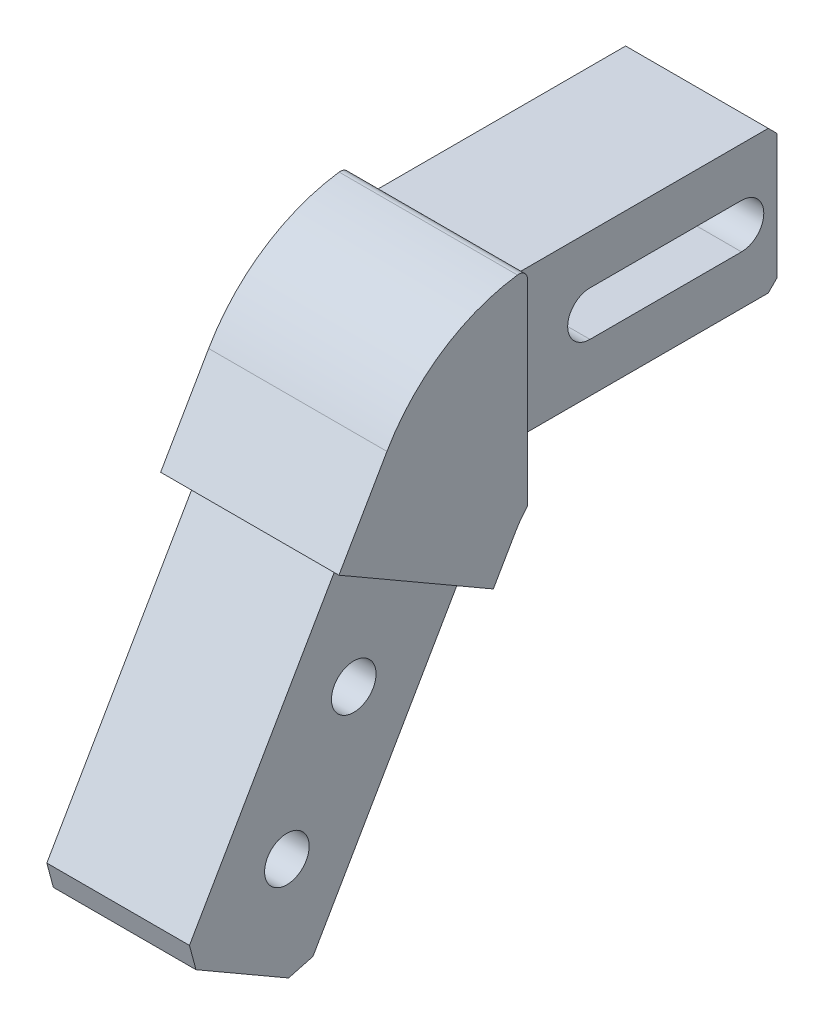
ISO-10303-21;
HEADER;
FILE_DESCRIPTION(('STEP AP214'),'2;1');
FILE_NAME('part.step','',(''),(''),'','','');
FILE_SCHEMA(('AUTOMOTIVE_DESIGN { 1 0 10303 214 1 1 1 1 }'));
ENDSEC;
DATA;
#1=APPLICATION_CONTEXT('core data for automotive mechanical design processes');
#2=APPLICATION_PROTOCOL_DEFINITION('international standard','automotive_design',2000,#1);
#3=PRODUCT_CONTEXT('',#1,'mechanical');
#4=PRODUCT('Part','Part','',(#3));
#5=PRODUCT_RELATED_PRODUCT_CATEGORY('part','',(#4));
#6=PRODUCT_DEFINITION_FORMATION('','',#4);
#7=PRODUCT_DEFINITION_CONTEXT('part definition',#1,'design');
#8=PRODUCT_DEFINITION('design','',#6,#7);
#9=PRODUCT_DEFINITION_SHAPE('','',#8);
#10=(LENGTH_UNIT() NAMED_UNIT(*) SI_UNIT(.MILLI.,.METRE.));
#11=(NAMED_UNIT(*) PLANE_ANGLE_UNIT() SI_UNIT($,.RADIAN.));
#12=(NAMED_UNIT(*) SI_UNIT($,.STERADIAN.) SOLID_ANGLE_UNIT());
#13=UNCERTAINTY_MEASURE_WITH_UNIT(LENGTH_MEASURE(1.E-05),#10,'distance_accuracy_value','');
#14=(GEOMETRIC_REPRESENTATION_CONTEXT(3) GLOBAL_UNCERTAINTY_ASSIGNED_CONTEXT((#13)) GLOBAL_UNIT_ASSIGNED_CONTEXT((#10,
#11,#12)) REPRESENTATION_CONTEXT('',''));
#15=CARTESIAN_POINT('',(0.,0.,0.));
#16=DIRECTION('',(0.,0.,1.));
#17=DIRECTION('',(1.,0.,0.));
#18=AXIS2_PLACEMENT_3D('',#15,#16,#17);
#19=CARTESIAN_POINT('',(16.,-10.,-17.3205080756888));
#20=DIRECTION('',(-1.,0.,0.));
#21=DIRECTION('',(0.,0.,1.));
#22=AXIS2_PLACEMENT_3D('',#19,#20,#21);
#23=PLANE('',#22);
#24=CARTESIAN_POINT('',(16.,10.,-19.0000000000001));
#25=DIRECTION('',(1.,0.,0.));
#26=DIRECTION('',(0.,0.,-1.));
#27=AXIS2_PLACEMENT_3D('',#24,#25,#26);
#28=CIRCLE('',#27,2.5);
#29=CARTESIAN_POINT('',(16.,12.5,-19.0000000000001));
#30=VERTEX_POINT('',#29);
#31=CARTESIAN_POINT('',(16.,7.5,-19.0000000000001));
#32=VERTEX_POINT('',#31);
#33=EDGE_CURVE('E254',#30,#32,#28,.T.);
#34=ORIENTED_EDGE('',*,*,#33,.F.);
#35=DIRECTION('',(0.,0.,1.));
#36=VECTOR('',#35,1.);
#37=CARTESIAN_POINT('',(16.,12.5,-19.0000000000001));
#38=LINE('',#37,#36);
#39=CARTESIAN_POINT('',(16.,12.5,-36.0000000000001));
#40=VERTEX_POINT('',#39);
#41=EDGE_CURVE('E262',#40,#30,#38,.T.);
#42=ORIENTED_EDGE('',*,*,#41,.F.);
#43=CARTESIAN_POINT('',(16.,10.,-36.0000000000001));
#44=DIRECTION('',(1.,0.,0.));
#45=DIRECTION('',(0.,0.,-1.));
#46=AXIS2_PLACEMENT_3D('',#43,#44,#45);
#47=CIRCLE('',#46,2.5);
#48=CARTESIAN_POINT('',(16.,7.5,-36.0000000000001));
#49=VERTEX_POINT('',#48);
#50=EDGE_CURVE('E259',#49,#40,#47,.T.);
#51=ORIENTED_EDGE('',*,*,#50,.F.);
#52=DIRECTION('',(0.,0.,-1.));
#53=VECTOR('',#52,1.);
#54=CARTESIAN_POINT('',(16.,7.5,-36.0000000000001));
#55=LINE('',#54,#53);
#56=EDGE_CURVE('E256',#32,#49,#55,.T.);
#57=ORIENTED_EDGE('',*,*,#56,.F.);
#58=EDGE_LOOP('',(#34,#42,#51,#57));
#59=FACE_BOUND('',#58,.T.);
#60=DIRECTION('',(0.,0.,1.));
#61=VECTOR('',#60,1.);
#62=CARTESIAN_POINT('',(16.,18.,-15.0000000000001));
#63=LINE('',#62,#61);
#64=CARTESIAN_POINT('',(16.,18.,-39.0000000000001));
#65=VERTEX_POINT('',#64);
#66=CARTESIAN_POINT('',(16.,18.,-10.));
#67=VERTEX_POINT('',#66);
#68=EDGE_CURVE('E300',#65,#67,#63,.T.);
#69=ORIENTED_EDGE('',*,*,#68,.T.);
#70=DIRECTION('',(0.,-1.,0.));
#71=VECTOR('',#70,1.);
#72=CARTESIAN_POINT('',(16.,-10.,-10.));
#73=LINE('',#72,#71);
#74=CARTESIAN_POINT('',(16.,2.,-10.));
#75=VERTEX_POINT('',#74);
#76=EDGE_CURVE('E246',#67,#75,#73,.T.);
#77=ORIENTED_EDGE('',*,*,#76,.T.);
#78=DIRECTION('',(0.,0.,-1.));
#79=VECTOR('',#78,1.);
#80=CARTESIAN_POINT('',(16.,2.,-15.0000000000001));
#81=LINE('',#80,#79);
#82=CARTESIAN_POINT('',(16.,2.,-39.0000000000001));
#83=VERTEX_POINT('',#82);
#84=EDGE_CURVE('E311',#75,#83,#81,.T.);
#85=ORIENTED_EDGE('',*,*,#84,.T.);
#86=DIRECTION('',(0.,0.707106781186547,-0.707106781186548));
#87=VECTOR('',#86,1.);
#88=CARTESIAN_POINT('',(16.,2.,-39.0000000000001));
#89=LINE('',#88,#87);
#90=CARTESIAN_POINT('',(16.,3.,-40.0000000000001));
#91=VERTEX_POINT('',#90);
#92=EDGE_CURVE('E313',#83,#91,#89,.T.);
#93=ORIENTED_EDGE('',*,*,#92,.T.);
#94=DIRECTION('',(0.,1.,0.));
#95=VECTOR('',#94,1.);
#96=CARTESIAN_POINT('',(16.,3.,-40.0000000000001));
#97=LINE('',#96,#95);
#98=CARTESIAN_POINT('',(16.,17.,-40.0000000000001));
#99=VERTEX_POINT('',#98);
#100=EDGE_CURVE('E315',#91,#99,#97,.T.);
#101=ORIENTED_EDGE('',*,*,#100,.T.);
#102=DIRECTION('',(0.,0.707106781186547,0.707106781186547));
#103=VECTOR('',#102,1.);
#104=CARTESIAN_POINT('',(16.,18.,-39.0000000000001));
#105=LINE('',#104,#103);
#106=EDGE_CURVE('E297',#99,#65,#105,.T.);
#107=ORIENTED_EDGE('',*,*,#106,.T.);
#108=EDGE_LOOP('',(#69,#77,#85,#93,#101,#107));
#109=FACE_BOUND('',#108,.T.);
#110=ADVANCED_FACE('F39',(#59,#109),#23,.F.);
#111=CARTESIAN_POINT('',(0.,-10.,-17.3205080756888));
#112=DIRECTION('',(-1.,0.,0.));
#113=DIRECTION('',(0.,0.,1.));
#114=AXIS2_PLACEMENT_3D('',#111,#112,#113);
#115=PLANE('',#114);
#116=DIRECTION('',(0.,-1.,0.));
#117=VECTOR('',#116,1.);
#118=CARTESIAN_POINT('',(0.,-10.,-10.));
#119=LINE('',#118,#117);
#120=CARTESIAN_POINT('',(0.,18.,-10.));
#121=VERTEX_POINT('',#120);
#122=CARTESIAN_POINT('',(0.,2.,-10.));
#123=VERTEX_POINT('',#122);
#124=EDGE_CURVE('E244',#121,#123,#119,.T.);
#125=ORIENTED_EDGE('',*,*,#124,.F.);
#126=DIRECTION('',(0.,0.,1.));
#127=VECTOR('',#126,1.);
#128=CARTESIAN_POINT('',(0.,18.,-15.0000000000001));
#129=LINE('',#128,#127);
#130=CARTESIAN_POINT('',(0.,18.,-39.0000000000001));
#131=VERTEX_POINT('',#130);
#132=EDGE_CURVE('E320',#131,#121,#129,.T.);
#133=ORIENTED_EDGE('',*,*,#132,.F.);
#134=DIRECTION('',(0.,0.707106781186547,0.707106781186547));
#135=VECTOR('',#134,1.);
#136=CARTESIAN_POINT('',(0.,18.,-39.0000000000001));
#137=LINE('',#136,#135);
#138=CARTESIAN_POINT('',(0.,17.,-40.0000000000001));
#139=VERTEX_POINT('',#138);
#140=EDGE_CURVE('E294',#139,#131,#137,.T.);
#141=ORIENTED_EDGE('',*,*,#140,.F.);
#142=DIRECTION('',(0.,1.,0.));
#143=VECTOR('',#142,1.);
#144=CARTESIAN_POINT('',(0.,3.,-40.0000000000001));
#145=LINE('',#144,#143);
#146=CARTESIAN_POINT('',(0.,3.,-40.0000000000001));
#147=VERTEX_POINT('',#146);
#148=EDGE_CURVE('E301',#147,#139,#145,.T.);
#149=ORIENTED_EDGE('',*,*,#148,.F.);
#150=DIRECTION('',(0.,0.707106781186547,-0.707106781186548));
#151=VECTOR('',#150,1.);
#152=CARTESIAN_POINT('',(0.,2.,-39.0000000000001));
#153=LINE('',#152,#151);
#154=CARTESIAN_POINT('',(0.,2.,-39.0000000000001));
#155=VERTEX_POINT('',#154);
#156=EDGE_CURVE('E333',#155,#147,#153,.T.);
#157=ORIENTED_EDGE('',*,*,#156,.F.);
#158=DIRECTION('',(0.,0.,-1.));
#159=VECTOR('',#158,1.);
#160=CARTESIAN_POINT('',(0.,2.,-15.0000000000001));
#161=LINE('',#160,#159);
#162=EDGE_CURVE('E331',#123,#155,#161,.T.);
#163=ORIENTED_EDGE('',*,*,#162,.F.);
#164=EDGE_LOOP('',(#125,#133,#141,#149,#157,#163));
#165=FACE_BOUND('',#164,.T.);
#166=DIRECTION('',(0.,0.,1.));
#167=VECTOR('',#166,1.);
#168=CARTESIAN_POINT('',(0.,12.5,-19.0000000000001));
#169=LINE('',#168,#167);
#170=CARTESIAN_POINT('',(0.,12.5,-36.0000000000001));
#171=VERTEX_POINT('',#170);
#172=CARTESIAN_POINT('',(0.,12.5,-19.0000000000001));
#173=VERTEX_POINT('',#172);
#174=EDGE_CURVE('E257',#171,#173,#169,.T.);
#175=ORIENTED_EDGE('',*,*,#174,.T.);
#176=CARTESIAN_POINT('',(0.,10.,-19.0000000000001));
#177=DIRECTION('',(1.,0.,0.));
#178=DIRECTION('',(0.,0.,-1.));
#179=AXIS2_PLACEMENT_3D('',#176,#177,#178);
#180=CIRCLE('',#179,2.5);
#181=CARTESIAN_POINT('',(0.,7.5,-19.0000000000001));
#182=VERTEX_POINT('',#181);
#183=EDGE_CURVE('E253',#173,#182,#180,.T.);
#184=ORIENTED_EDGE('',*,*,#183,.T.);
#185=DIRECTION('',(0.,0.,-1.));
#186=VECTOR('',#185,1.);
#187=CARTESIAN_POINT('',(0.,7.5,-36.0000000000001));
#188=LINE('',#187,#186);
#189=CARTESIAN_POINT('',(0.,7.5,-36.0000000000001));
#190=VERTEX_POINT('',#189);
#191=EDGE_CURVE('E267',#182,#190,#188,.T.);
#192=ORIENTED_EDGE('',*,*,#191,.T.);
#193=CARTESIAN_POINT('',(0.,10.,-36.0000000000001));
#194=DIRECTION('',(1.,0.,0.));
#195=DIRECTION('',(0.,0.,-1.));
#196=AXIS2_PLACEMENT_3D('',#193,#194,#195);
#197=CIRCLE('',#196,2.5);
#198=EDGE_CURVE('E270',#190,#171,#197,.T.);
#199=ORIENTED_EDGE('',*,*,#198,.T.);
#200=EDGE_LOOP('',(#175,#184,#192,#199));
#201=FACE_BOUND('',#200,.T.);
#202=ADVANCED_FACE('F408',(#165,#201),#115,.T.);
#203=CARTESIAN_POINT('',(16.,-12.9903810567665,7.50000000000006));
#204=DIRECTION('',(1.,0.,0.));
#205=DIRECTION('',(0.,0.,-1.));
#206=AXIS2_PLACEMENT_3D('',#203,#204,#205);
#207=CIRCLE('',#206,2.5);
#208=CARTESIAN_POINT('',(16.,-12.9903810567665,5.00000000000006));
#209=VERTEX_POINT('',#208);
#210=EDGE_CURVE('E285',#209,#209,#207,.T.);
#211=ORIENTED_EDGE('',*,*,#210,.F.);
#212=EDGE_LOOP('',(#211));
#213=FACE_BOUND('',#212,.T.);
#214=CARTESIAN_POINT('',(16.,-25.9807621135331,15.0000000000001));
#215=DIRECTION('',(1.,0.,0.));
#216=DIRECTION('',(0.,0.,-1.));
#217=AXIS2_PLACEMENT_3D('',#214,#215,#216);
#218=CIRCLE('',#217,2.5);
#219=CARTESIAN_POINT('',(16.,-25.9807621135331,12.5000000000001));
#220=VERTEX_POINT('',#219);
#221=EDGE_CURVE('E291',#220,#220,#218,.T.);
#222=ORIENTED_EDGE('',*,*,#221,.F.);
#223=EDGE_LOOP('',(#222));
#224=FACE_BOUND('',#223,.T.);
#225=DIRECTION('',(0.,-0.500000000000005,-0.866025403784436));
#226=VECTOR('',#225,1.);
#227=CARTESIAN_POINT('',(16.,-30.6410161513774,26.9282032302756));
#228=LINE('',#227,#226);
#229=CARTESIAN_POINT('',(16.,-31.6410161513774,25.1961524227068));
#230=VERTEX_POINT('',#229);
#231=CARTESIAN_POINT('',(16.,-37.6410161513775,14.8038475772936));
#232=VERTEX_POINT('',#231);
#233=EDGE_CURVE('E306',#230,#232,#228,.T.);
#234=ORIENTED_EDGE('',*,*,#233,.T.);
#235=DIRECTION('',(0.,-0.258819045102513,0.965925826289071));
#236=VECTOR('',#235,1.);
#237=CARTESIAN_POINT('',(16.,-36.9089653438087,12.0717967697247));
#238=LINE('',#237,#236);
#239=CARTESIAN_POINT('',(16.,-36.9089653438087,12.0717967697247));
#240=VERTEX_POINT('',#239);
#241=EDGE_CURVE('E378',#232,#240,#238,.F.);
#242=ORIENTED_EDGE('',*,*,#241,.T.);
#243=DIRECTION('',(0.,0.866025403784436,-0.500000000000004));
#244=VECTOR('',#243,1.);
#245=CARTESIAN_POINT('',(16.,-38.6410161513775,13.0717967697247));
#246=LINE('',#245,#244);
#247=CARTESIAN_POINT('',(16.,-8.33012701892221,-4.42820323027547));
#248=VERTEX_POINT('',#247);
#249=EDGE_CURVE('E309',#240,#248,#246,.T.);
#250=ORIENTED_EDGE('',*,*,#249,.T.);
#251=DIRECTION('',(0.,0.500000000000004,0.866025403784437));
#252=VECTOR('',#251,1.);
#253=CARTESIAN_POINT('',(16.,-14.3301270189223,-14.8205080756887));
#254=LINE('',#253,#252);
#255=CARTESIAN_POINT('',(16.,-0.330127018922152,9.42820323027552));
#256=VERTEX_POINT('',#255);
#257=EDGE_CURVE('E250',#248,#256,#254,.T.);
#258=ORIENTED_EDGE('',*,*,#257,.T.);
#259=DIRECTION('',(0.,-0.866025403784436,0.500000000000004));
#260=VECTOR('',#259,1.);
#261=CARTESIAN_POINT('',(16.,-30.6410161513774,26.9282032302756));
#262=LINE('',#261,#260);
#263=CARTESIAN_POINT('',(16.,-28.9089653438085,25.9282032302756));
#264=VERTEX_POINT('',#263);
#265=EDGE_CURVE('E303',#256,#264,#262,.T.);
#266=ORIENTED_EDGE('',*,*,#265,.T.);
#267=DIRECTION('',(0.,0.96592582628907,0.258819045102513));
#268=VECTOR('',#267,1.);
#269=CARTESIAN_POINT('',(16.,-31.6410161513774,25.1961524227068));
#270=LINE('',#269,#268);
#271=EDGE_CURVE('E376',#264,#230,#270,.F.);
#272=ORIENTED_EDGE('',*,*,#271,.T.);
#273=EDGE_LOOP('',(#234,#242,#250,#258,#266,#272));
#274=FACE_BOUND('',#273,.T.);
#275=ADVANCED_FACE('F411',(#213,#224,#274),#23,.F.);
#276=DIRECTION('',(0.,0.866025403784436,-0.500000000000004));
#277=VECTOR('',#276,1.);
#278=CARTESIAN_POINT('',(0.,-38.6410161513775,13.0717967697247));
#279=LINE('',#278,#277);
#280=CARTESIAN_POINT('',(0.,-36.9089653438087,12.0717967697247));
#281=VERTEX_POINT('',#280);
#282=CARTESIAN_POINT('',(0.,-8.33012701892222,-4.42820323027546));
#283=VERTEX_POINT('',#282);
#284=EDGE_CURVE('E329',#281,#283,#279,.T.);
#285=ORIENTED_EDGE('',*,*,#284,.F.);
#286=DIRECTION('',(0.,0.258819045102513,-0.965925826289071));
#287=VECTOR('',#286,1.);
#288=CARTESIAN_POINT('',(0.,-27.758330249198,-22.0788383248864));
#289=LINE('',#288,#287);
#290=CARTESIAN_POINT('',(0.,-37.6410161513775,14.8038475772936));
#291=VERTEX_POINT('',#290);
#292=EDGE_CURVE('E369',#281,#291,#289,.F.);
#293=ORIENTED_EDGE('',*,*,#292,.T.);
#294=DIRECTION('',(0.,-0.500000000000005,-0.866025403784436));
#295=VECTOR('',#294,1.);
#296=CARTESIAN_POINT('',(0.,-30.6410161513774,26.9282032302756));
#297=LINE('',#296,#295);
#298=CARTESIAN_POINT('',(0.,-31.6410161513774,25.1961524227068));
#299=VERTEX_POINT('',#298);
#300=EDGE_CURVE('E326',#299,#291,#297,.T.);
#301=ORIENTED_EDGE('',*,*,#300,.F.);
#302=DIRECTION('',(0.,-0.96592582628907,-0.258819045102513));
#303=VECTOR('',#302,1.);
#304=CARTESIAN_POINT('',(0.,-22.0788383248861,27.7583302491978));
#305=LINE('',#304,#303);
#306=CARTESIAN_POINT('',(0.,-28.9089653438085,25.9282032302756));
#307=VERTEX_POINT('',#306);
#308=EDGE_CURVE('E367',#299,#307,#305,.F.);
#309=ORIENTED_EDGE('',*,*,#308,.T.);
#310=DIRECTION('',(0.,-0.866025403784436,0.500000000000004));
#311=VECTOR('',#310,1.);
#312=CARTESIAN_POINT('',(0.,-30.6410161513774,26.9282032302756));
#313=LINE('',#312,#311);
#314=CARTESIAN_POINT('',(0.,-0.330127018922146,9.42820323027551));
#315=VERTEX_POINT('',#314);
#316=EDGE_CURVE('E323',#315,#307,#313,.T.);
#317=ORIENTED_EDGE('',*,*,#316,.F.);
#318=DIRECTION('',(0.,0.500000000000004,0.866025403784437));
#319=VECTOR('',#318,1.);
#320=CARTESIAN_POINT('',(0.,-14.3301270189223,-14.8205080756887));
#321=LINE('',#320,#319);
#322=EDGE_CURVE('E248',#283,#315,#321,.T.);
#323=ORIENTED_EDGE('',*,*,#322,.F.);
#324=EDGE_LOOP('',(#285,#293,#301,#309,#317,#323));
#325=FACE_BOUND('',#324,.T.);
#326=CARTESIAN_POINT('',(0.,-25.9807621135331,15.0000000000001));
#327=DIRECTION('',(1.,0.,0.));
#328=DIRECTION('',(0.,0.,-1.));
#329=AXIS2_PLACEMENT_3D('',#326,#327,#328);
#330=CIRCLE('',#329,2.5);
#331=CARTESIAN_POINT('',(0.,-25.9807621135331,12.5000000000001));
#332=VERTEX_POINT('',#331);
#333=EDGE_CURVE('E288',#332,#332,#330,.T.);
#334=ORIENTED_EDGE('',*,*,#333,.T.);
#335=EDGE_LOOP('',(#334));
#336=FACE_BOUND('',#335,.T.);
#337=CARTESIAN_POINT('',(0.,-12.9903810567665,7.50000000000006));
#338=DIRECTION('',(1.,0.,0.));
#339=DIRECTION('',(0.,0.,-1.));
#340=AXIS2_PLACEMENT_3D('',#337,#338,#339);
#341=CIRCLE('',#340,2.5);
#342=CARTESIAN_POINT('',(0.,-12.9903810567665,5.00000000000006));
#343=VERTEX_POINT('',#342);
#344=EDGE_CURVE('E284',#343,#343,#341,.T.);
#345=ORIENTED_EDGE('',*,*,#344,.T.);
#346=EDGE_LOOP('',(#345));
#347=FACE_BOUND('',#346,.T.);
#348=ADVANCED_FACE('F417',(#325,#336,#347),#115,.T.);
#349=CARTESIAN_POINT('',(16.,18.,-39.0000000000001));
#350=DIRECTION('',(0.,-0.707106781186547,0.707106781186547));
#351=DIRECTION('',(0.,-0.707106781186548,-0.707106781186548));
#352=AXIS2_PLACEMENT_3D('',#349,#350,#351);
#353=PLANE('',#352);
#354=ORIENTED_EDGE('',*,*,#140,.T.);
#355=DIRECTION('',(-1.,0.,0.));
#356=VECTOR('',#355,1.);
#357=CARTESIAN_POINT('',(16.,18.,-39.0000000000001));
#358=LINE('',#357,#356);
#359=EDGE_CURVE('E361',#65,#131,#358,.T.);
#360=ORIENTED_EDGE('',*,*,#359,.F.);
#361=ORIENTED_EDGE('',*,*,#106,.F.);
#362=DIRECTION('',(-1.,0.,0.));
#363=VECTOR('',#362,1.);
#364=CARTESIAN_POINT('',(16.,17.,-40.0000000000001));
#365=LINE('',#364,#363);
#366=EDGE_CURVE('E317',#99,#139,#365,.T.);
#367=ORIENTED_EDGE('',*,*,#366,.T.);
#368=EDGE_LOOP('',(#354,#360,#361,#367));
#369=FACE_BOUND('',#368,.T.);
#370=ADVANCED_FACE('F426',(#369),#353,.F.);
#371=CARTESIAN_POINT('',(16.,18.,-15.0000000000001));
#372=DIRECTION('',(0.,-1.,0.));
#373=DIRECTION('',(0.,0.,-1.));
#374=AXIS2_PLACEMENT_3D('',#371,#372,#373);
#375=PLANE('',#374);
#376=ORIENTED_EDGE('',*,*,#132,.T.);
#377=DIRECTION('',(-1.,0.,0.));
#378=VECTOR('',#377,1.);
#379=CARTESIAN_POINT('',(16.,18.,-10.));
#380=LINE('',#379,#378);
#381=EDGE_CURVE('E358',#67,#121,#380,.T.);
#382=ORIENTED_EDGE('',*,*,#381,.F.);
#383=ORIENTED_EDGE('',*,*,#68,.F.);
#384=ORIENTED_EDGE('',*,*,#359,.T.);
#385=EDGE_LOOP('',(#376,#382,#383,#384));
#386=FACE_BOUND('',#385,.T.);
#387=ADVANCED_FACE('F467',(#386),#375,.F.);
#388=CARTESIAN_POINT('',(16.,0.,-11.5470053837925));
#389=DIRECTION('',(-1.,0.,0.));
#390=DIRECTION('',(0.,0.,1.));
#391=AXIS2_PLACEMENT_3D('',#388,#389,#390);
#392=CYLINDRICAL_SURFACE('',#391,20.);
#393=CARTESIAN_POINT('',(18.,0.,-11.5470053837925));
#394=DIRECTION('',(1.,0.,0.));
#395=DIRECTION('',(0.,0.,1.));
#396=AXIS2_PLACEMENT_3D('',#393,#394,#395);
#397=CIRCLE('',#396,20.);
#398=CARTESIAN_POINT('',(18.,19.8194835048448,-8.86594708506361));
#399=VERTEX_POINT('',#398);
#400=CARTESIAN_POINT('',(18.,10.,5.77350269189623));
#401=VERTEX_POINT('',#400);
#402=EDGE_CURVE('E220',#399,#401,#397,.T.);
#403=ORIENTED_EDGE('',*,*,#402,.F.);
#404=DIRECTION('',(-1.,0.,0.));
#405=VECTOR('',#404,1.);
#406=CARTESIAN_POINT('',(16.,19.8194835048448,-8.86594708506361));
#407=LINE('',#406,#405);
#408=CARTESIAN_POINT('',(-2.,19.8194835048448,-8.86594708506361));
#409=VERTEX_POINT('',#408);
#410=EDGE_CURVE('E382',#399,#409,#407,.T.);
#411=ORIENTED_EDGE('',*,*,#410,.T.);
#412=CARTESIAN_POINT('',(-2.,0.,-11.5470053837925));
#413=DIRECTION('',(1.,0.,0.));
#414=DIRECTION('',(0.,0.,1.));
#415=AXIS2_PLACEMENT_3D('',#412,#413,#414);
#416=CIRCLE('',#415,20.);
#417=CARTESIAN_POINT('',(-2.,10.,5.77350269189623));
#418=VERTEX_POINT('',#417);
#419=EDGE_CURVE('E242',#409,#418,#416,.T.);
#420=ORIENTED_EDGE('',*,*,#419,.T.);
#421=DIRECTION('',(-1.,0.,0.));
#422=VECTOR('',#421,1.);
#423=CARTESIAN_POINT('',(16.,10.,5.77350269189623));
#424=LINE('',#423,#422);
#425=EDGE_CURVE('E205',#401,#418,#424,.T.);
#426=ORIENTED_EDGE('',*,*,#425,.F.);
#427=EDGE_LOOP('',(#403,#411,#420,#426));
#428=FACE_BOUND('',#427,.T.);
#429=ADVANCED_FACE('F387',(#428),#392,.T.);
#430=CARTESIAN_POINT('',(16.,10.,5.77350269189623));
#431=DIRECTION('',(0.,-0.500000000000005,-0.866025403784436));
#432=DIRECTION('',(0.,0.866025403784436,-0.500000000000005));
#433=AXIS2_PLACEMENT_3D('',#430,#431,#432);
#434=PLANE('',#433);
#435=ORIENTED_EDGE('',*,*,#425,.T.);
#436=DIRECTION('',(0.,-0.866025403784436,0.500000000000005));
#437=VECTOR('',#436,1.);
#438=CARTESIAN_POINT('',(-2.,0.66987298107786,11.1602540378444));
#439=LINE('',#438,#437);
#440=CARTESIAN_POINT('',(-2.,0.66987298107786,11.1602540378444));
#441=VERTEX_POINT('',#440);
#442=EDGE_CURVE('E201',#418,#441,#439,.T.);
#443=ORIENTED_EDGE('',*,*,#442,.T.);
#444=DIRECTION('',(-1.,0.,0.));
#445=VECTOR('',#444,1.);
#446=CARTESIAN_POINT('',(16.,0.66987298107786,11.1602540378444));
#447=LINE('',#446,#445);
#448=CARTESIAN_POINT('',(18.,0.66987298107786,11.1602540378444));
#449=VERTEX_POINT('',#448);
#450=EDGE_CURVE('E194',#449,#441,#447,.T.);
#451=ORIENTED_EDGE('',*,*,#450,.F.);
#452=DIRECTION('',(0.,-0.866025403784436,0.500000000000005));
#453=VECTOR('',#452,1.);
#454=CARTESIAN_POINT('',(18.,0.66987298107786,11.1602540378444));
#455=LINE('',#454,#453);
#456=EDGE_CURVE('E199',#401,#449,#455,.T.);
#457=ORIENTED_EDGE('',*,*,#456,.F.);
#458=EDGE_LOOP('',(#435,#443,#451,#457));
#459=FACE_BOUND('',#458,.T.);
#460=ADVANCED_FACE('F197',(#459),#434,.F.);
#461=CARTESIAN_POINT('',(16.,-30.6410161513774,26.9282032302756));
#462=DIRECTION('',(0.,-0.500000000000004,-0.866025403784436));
#463=DIRECTION('',(0.,0.866025403784436,-0.500000000000004));
#464=AXIS2_PLACEMENT_3D('',#461,#462,#463);
#465=PLANE('',#464);
#466=ORIENTED_EDGE('',*,*,#316,.T.);
#467=DIRECTION('',(1.,0.,0.));
#468=VECTOR('',#467,1.);
#469=CARTESIAN_POINT('',(16.,-28.9089653438085,25.9282032302756));
#470=LINE('',#469,#468);
#471=EDGE_CURVE('E380',#307,#264,#470,.T.);
#472=ORIENTED_EDGE('',*,*,#471,.T.);
#473=ORIENTED_EDGE('',*,*,#265,.F.);
#474=DIRECTION('',(-1.,0.,0.));
#475=VECTOR('',#474,1.);
#476=CARTESIAN_POINT('',(16.,-0.330127018922146,9.42820323027551));
#477=LINE('',#476,#475);
#478=EDGE_CURVE('E206',#256,#315,#477,.T.);
#479=ORIENTED_EDGE('',*,*,#478,.T.);
#480=EDGE_LOOP('',(#466,#472,#473,#479));
#481=FACE_BOUND('',#480,.T.);
#482=ADVANCED_FACE('F454',(#481),#465,.F.);
#483=CARTESIAN_POINT('',(16.,-30.6410161513774,26.9282032302756));
#484=DIRECTION('',(0.,0.866025403784436,-0.500000000000005));
#485=DIRECTION('',(0.,0.500000000000005,0.866025403784436));
#486=AXIS2_PLACEMENT_3D('',#483,#484,#485);
#487=PLANE('',#486);
#488=ORIENTED_EDGE('',*,*,#300,.T.);
#489=DIRECTION('',(1.,0.,0.));
#490=VECTOR('',#489,1.);
#491=CARTESIAN_POINT('',(16.,-37.6410161513775,14.8038475772936));
#492=LINE('',#491,#490);
#493=EDGE_CURVE('E374',#291,#232,#492,.T.);
#494=ORIENTED_EDGE('',*,*,#493,.T.);
#495=ORIENTED_EDGE('',*,*,#233,.F.);
#496=DIRECTION('',(-1.,0.,0.));
#497=VECTOR('',#496,1.);
#498=CARTESIAN_POINT('',(16.,-31.6410161513774,25.1961524227068));
#499=LINE('',#498,#497);
#500=EDGE_CURVE('E371',#230,#299,#499,.T.);
#501=ORIENTED_EDGE('',*,*,#500,.T.);
#502=EDGE_LOOP('',(#488,#494,#495,#501));
#503=FACE_BOUND('',#502,.T.);
#504=ADVANCED_FACE('F453',(#503),#487,.F.);
#505=CARTESIAN_POINT('',(16.,-38.6410161513775,13.0717967697247));
#506=DIRECTION('',(0.,0.500000000000004,0.866025403784436));
#507=DIRECTION('',(0.,-0.866025403784436,0.500000000000004));
#508=AXIS2_PLACEMENT_3D('',#505,#506,#507);
#509=PLANE('',#508);
#510=ORIENTED_EDGE('',*,*,#249,.F.);
#511=DIRECTION('',(-1.,0.,0.));
#512=VECTOR('',#511,1.);
#513=CARTESIAN_POINT('',(16.,-36.9089653438087,12.0717967697247));
#514=LINE('',#513,#512);
#515=EDGE_CURVE('E364',#240,#281,#514,.T.);
#516=ORIENTED_EDGE('',*,*,#515,.T.);
#517=ORIENTED_EDGE('',*,*,#284,.T.);
#518=DIRECTION('',(-1.,0.,0.));
#519=VECTOR('',#518,1.);
#520=CARTESIAN_POINT('',(16.,-8.33012701892221,-4.42820323027547));
#521=LINE('',#520,#519);
#522=EDGE_CURVE('E352',#248,#283,#521,.T.);
#523=ORIENTED_EDGE('',*,*,#522,.F.);
#524=EDGE_LOOP('',(#510,#516,#517,#523));
#525=FACE_BOUND('',#524,.T.);
#526=ADVANCED_FACE('F443',(#525),#509,.F.);
#527=CARTESIAN_POINT('',(16.,-8.33012701892221,-4.42820323027547));
#528=DIRECTION('',(0.,0.866025403784436,-0.500000000000004));
#529=DIRECTION('',(0.,0.500000000000004,0.866025403784436));
#530=AXIS2_PLACEMENT_3D('',#527,#528,#529);
#531=PLANE('',#530);
#532=DIRECTION('',(-1.,0.,0.));
#533=VECTOR('',#532,1.);
#534=CARTESIAN_POINT('',(16.,-9.33012701892222,-6.16025403784434));
#535=LINE('',#534,#533);
#536=CARTESIAN_POINT('',(18.,-9.33012701892222,-6.16025403784434));
#537=VERTEX_POINT('',#536);
#538=CARTESIAN_POINT('',(-2.,-9.33012701892222,-6.16025403784434));
#539=VERTEX_POINT('',#538);
#540=EDGE_CURVE('E212',#537,#539,#535,.T.);
#541=ORIENTED_EDGE('',*,*,#540,.F.);
#542=DIRECTION('',(0.,-0.500000000000004,-0.866025403784436));
#543=VECTOR('',#542,1.);
#544=CARTESIAN_POINT('',(18.,0.66987298107786,11.1602540378444));
#545=LINE('',#544,#543);
#546=EDGE_CURVE('E209',#449,#537,#545,.T.);
#547=ORIENTED_EDGE('',*,*,#546,.F.);
#548=ORIENTED_EDGE('',*,*,#450,.T.);
#549=DIRECTION('',(0.,-0.500000000000004,-0.866025403784436));
#550=VECTOR('',#549,1.);
#551=CARTESIAN_POINT('',(-2.,0.66987298107786,11.1602540378444));
#552=LINE('',#551,#550);
#553=EDGE_CURVE('E232',#441,#539,#552,.T.);
#554=ORIENTED_EDGE('',*,*,#553,.T.);
#555=EDGE_LOOP('',(#541,#547,#548,#554));
#556=FACE_BOUND('',#555,.T.);
#557=ORIENTED_EDGE('',*,*,#522,.T.);
#558=ORIENTED_EDGE('',*,*,#322,.T.);
#559=ORIENTED_EDGE('',*,*,#478,.F.);
#560=ORIENTED_EDGE('',*,*,#257,.F.);
#561=EDGE_LOOP('',(#557,#558,#559,#560));
#562=FACE_BOUND('',#561,.T.);
#563=ADVANCED_FACE('F210',(#556,#562),#531,.F.);
#564=CARTESIAN_POINT('',(16.,-5.,-8.66025403784439));
#565=DIRECTION('',(0.,0.500000000000006,0.866025403784435));
#566=DIRECTION('',(0.,-0.866025403784435,0.500000000000006));
#567=AXIS2_PLACEMENT_3D('',#564,#565,#566);
#568=PLANE('',#567);
#569=ORIENTED_EDGE('',*,*,#540,.T.);
#570=DIRECTION('',(0.,0.866025403784435,-0.500000000000006));
#571=VECTOR('',#570,1.);
#572=CARTESIAN_POINT('',(-2.,-9.33012701892222,-6.16025403784434));
#573=LINE('',#572,#571);
#574=CARTESIAN_POINT('',(-2.,-5.,-8.66025403784439));
#575=VERTEX_POINT('',#574);
#576=EDGE_CURVE('E234',#539,#575,#573,.T.);
#577=ORIENTED_EDGE('',*,*,#576,.T.);
#578=DIRECTION('',(-1.,0.,0.));
#579=VECTOR('',#578,1.);
#580=CARTESIAN_POINT('',(16.,-5.,-8.66025403784439));
#581=LINE('',#580,#579);
#582=CARTESIAN_POINT('',(18.,-5.,-8.66025403784439));
#583=VERTEX_POINT('',#582);
#584=EDGE_CURVE('E349',#583,#575,#581,.T.);
#585=ORIENTED_EDGE('',*,*,#584,.F.);
#586=DIRECTION('',(0.,0.866025403784435,-0.500000000000006));
#587=VECTOR('',#586,1.);
#588=CARTESIAN_POINT('',(18.,-9.33012701892222,-6.16025403784434));
#589=LINE('',#588,#587);
#590=EDGE_CURVE('E216',#537,#583,#589,.T.);
#591=ORIENTED_EDGE('',*,*,#590,.F.);
#592=EDGE_LOOP('',(#569,#577,#585,#591));
#593=FACE_BOUND('',#592,.T.);
#594=ADVANCED_FACE('F394',(#593),#568,.F.);
#595=CARTESIAN_POINT('',(16.,-10.,-17.3205080756888));
#596=DIRECTION('',(-1.,0.,0.));
#597=DIRECTION('',(0.,0.,1.));
#598=AXIS2_PLACEMENT_3D('',#595,#596,#597);
#599=CYLINDRICAL_SURFACE('',#598,10.);
#600=ORIENTED_EDGE('',*,*,#584,.T.);
#601=CARTESIAN_POINT('',(-2.,-10.0000000000003,-17.3205080756892));
#602=DIRECTION('',(-1.,0.,0.));
#603=DIRECTION('',(0.,0.,1.));
#604=AXIS2_PLACEMENT_3D('',#601,#602,#603);
#605=CIRCLE('',#604,10.0000000000006);
#606=CARTESIAN_POINT('',(-2.,-3.18749961366782,-10.));
#607=VERTEX_POINT('',#606);
#608=EDGE_CURVE('E237',#575,#607,#605,.T.);
#609=ORIENTED_EDGE('',*,*,#608,.T.);
#610=DIRECTION('',(-1.,0.,0.));
#611=VECTOR('',#610,1.);
#612=CARTESIAN_POINT('',(16.,-3.18749961366782,-10.));
#613=LINE('',#612,#611);
#614=CARTESIAN_POINT('',(18.,-3.18749961366782,-10.));
#615=VERTEX_POINT('',#614);
#616=EDGE_CURVE('E347',#615,#607,#613,.T.);
#617=ORIENTED_EDGE('',*,*,#616,.F.);
#618=CARTESIAN_POINT('',(18.,-10.0000000000003,-17.3205080756892));
#619=DIRECTION('',(-1.,0.,0.));
#620=DIRECTION('',(0.,0.,1.));
#621=AXIS2_PLACEMENT_3D('',#618,#619,#620);
#622=CIRCLE('',#621,10.0000000000006);
#623=EDGE_CURVE('E225',#583,#615,#622,.T.);
#624=ORIENTED_EDGE('',*,*,#623,.F.);
#625=EDGE_LOOP('',(#600,#609,#617,#624));
#626=FACE_BOUND('',#625,.T.);
#627=ADVANCED_FACE('F397',(#626),#599,.F.);
#628=CARTESIAN_POINT('',(16.,2.,-10.));
#629=DIRECTION('',(0.,0.,1.));
#630=DIRECTION('',(0.,-1.,0.));
#631=AXIS2_PLACEMENT_3D('',#628,#629,#630);
#632=PLANE('',#631);
#633=DIRECTION('',(0.,1.,0.));
#634=VECTOR('',#633,1.);
#635=CARTESIAN_POINT('',(-2.,19.9400795971961,-10.));
#636=LINE('',#635,#634);
#637=CARTESIAN_POINT('',(-2.,18.8285093296026,-10.));
#638=VERTEX_POINT('',#637);
#639=EDGE_CURVE('E240',#607,#638,#636,.T.);
#640=ORIENTED_EDGE('',*,*,#639,.T.);
#641=DIRECTION('',(-1.,0.,0.));
#642=VECTOR('',#641,1.);
#643=CARTESIAN_POINT('',(16.,18.8285093296026,-10.0000000000001));
#644=LINE('',#643,#642);
#645=CARTESIAN_POINT('',(18.,18.8285093296026,-10.));
#646=VERTEX_POINT('',#645);
#647=EDGE_CURVE('E47',#638,#646,#644,.F.);
#648=ORIENTED_EDGE('',*,*,#647,.T.);
#649=DIRECTION('',(0.,1.,0.));
#650=VECTOR('',#649,1.);
#651=CARTESIAN_POINT('',(18.,19.9400795971961,-10.));
#652=LINE('',#651,#650);
#653=EDGE_CURVE('E228',#615,#646,#652,.T.);
#654=ORIENTED_EDGE('',*,*,#653,.F.);
#655=ORIENTED_EDGE('',*,*,#616,.T.);
#656=EDGE_LOOP('',(#640,#648,#654,#655));
#657=FACE_BOUND('',#656,.T.);
#658=ORIENTED_EDGE('',*,*,#76,.F.);
#659=ORIENTED_EDGE('',*,*,#381,.T.);
#660=ORIENTED_EDGE('',*,*,#124,.T.);
#661=DIRECTION('',(-1.,0.,0.));
#662=VECTOR('',#661,1.);
#663=CARTESIAN_POINT('',(16.,2.,-10.));
#664=LINE('',#663,#662);
#665=EDGE_CURVE('E344',#75,#123,#664,.T.);
#666=ORIENTED_EDGE('',*,*,#665,.F.);
#667=EDGE_LOOP('',(#658,#659,#660,#666));
#668=FACE_BOUND('',#667,.T.);
#669=ADVANCED_FACE('F398',(#657,#668),#632,.F.);
#670=CARTESIAN_POINT('',(16.,2.,-15.0000000000001));
#671=DIRECTION('',(0.,1.,0.));
#672=DIRECTION('',(0.,0.,1.));
#673=AXIS2_PLACEMENT_3D('',#670,#671,#672);
#674=PLANE('',#673);
#675=ORIENTED_EDGE('',*,*,#162,.T.);
#676=DIRECTION('',(-1.,0.,0.));
#677=VECTOR('',#676,1.);
#678=CARTESIAN_POINT('',(16.,2.,-39.0000000000001));
#679=LINE('',#678,#677);
#680=EDGE_CURVE('E341',#83,#155,#679,.T.);
#681=ORIENTED_EDGE('',*,*,#680,.F.);
#682=ORIENTED_EDGE('',*,*,#84,.F.);
#683=ORIENTED_EDGE('',*,*,#665,.T.);
#684=EDGE_LOOP('',(#675,#681,#682,#683));
#685=FACE_BOUND('',#684,.T.);
#686=ADVANCED_FACE('F527',(#685),#674,.F.);
#687=CARTESIAN_POINT('',(16.,2.,-39.0000000000001));
#688=DIRECTION('',(0.,0.707106781186548,0.707106781186547));
#689=DIRECTION('',(0.,-0.707106781186547,0.707106781186548));
#690=AXIS2_PLACEMENT_3D('',#687,#688,#689);
#691=PLANE('',#690);
#692=ORIENTED_EDGE('',*,*,#156,.T.);
#693=DIRECTION('',(-1.,0.,0.));
#694=VECTOR('',#693,1.);
#695=CARTESIAN_POINT('',(16.,3.,-40.0000000000001));
#696=LINE('',#695,#694);
#697=EDGE_CURVE('E338',#91,#147,#696,.T.);
#698=ORIENTED_EDGE('',*,*,#697,.F.);
#699=ORIENTED_EDGE('',*,*,#92,.F.);
#700=ORIENTED_EDGE('',*,*,#680,.T.);
#701=EDGE_LOOP('',(#692,#698,#699,#700));
#702=FACE_BOUND('',#701,.T.);
#703=ADVANCED_FACE('F516',(#702),#691,.F.);
#704=CARTESIAN_POINT('',(16.,3.,-40.0000000000001));
#705=DIRECTION('',(0.,0.,1.));
#706=DIRECTION('',(1.,0.,0.));
#707=AXIS2_PLACEMENT_3D('',#704,#705,#706);
#708=PLANE('',#707);
#709=ORIENTED_EDGE('',*,*,#148,.T.);
#710=ORIENTED_EDGE('',*,*,#366,.F.);
#711=ORIENTED_EDGE('',*,*,#100,.F.);
#712=ORIENTED_EDGE('',*,*,#697,.T.);
#713=EDGE_LOOP('',(#709,#710,#711,#712));
#714=FACE_BOUND('',#713,.T.);
#715=ADVANCED_FACE('F511',(#714),#708,.F.);
#716=CARTESIAN_POINT('',(16.,-25.9807621135331,15.0000000000001));
#717=DIRECTION('',(-1.,0.,0.));
#718=DIRECTION('',(0.,0.,1.));
#719=AXIS2_PLACEMENT_3D('',#716,#717,#718);
#720=CYLINDRICAL_SURFACE('',#719,2.5);
#721=ORIENTED_EDGE('',*,*,#221,.T.);
#722=EDGE_LOOP('',(#721));
#723=FACE_BOUND('',#722,.T.);
#724=ORIENTED_EDGE('',*,*,#333,.F.);
#725=EDGE_LOOP('',(#724));
#726=FACE_BOUND('',#725,.T.);
#727=ADVANCED_FACE('F508',(#723,#726),#720,.F.);
#728=CARTESIAN_POINT('',(16.,-12.9903810567665,7.50000000000006));
#729=DIRECTION('',(-1.,0.,0.));
#730=DIRECTION('',(0.,0.,1.));
#731=AXIS2_PLACEMENT_3D('',#728,#729,#730);
#732=CYLINDRICAL_SURFACE('',#731,2.5);
#733=ORIENTED_EDGE('',*,*,#210,.T.);
#734=EDGE_LOOP('',(#733));
#735=FACE_BOUND('',#734,.T.);
#736=ORIENTED_EDGE('',*,*,#344,.F.);
#737=EDGE_LOOP('',(#736));
#738=FACE_BOUND('',#737,.T.);
#739=ADVANCED_FACE('F505',(#735,#738),#732,.F.);
#740=CARTESIAN_POINT('',(16.,10.,-19.0000000000001));
#741=DIRECTION('',(-1.,0.,0.));
#742=DIRECTION('',(0.,0.,1.));
#743=AXIS2_PLACEMENT_3D('',#740,#741,#742);
#744=CYLINDRICAL_SURFACE('',#743,2.5);
#745=ORIENTED_EDGE('',*,*,#183,.F.);
#746=DIRECTION('',(-1.,0.,0.));
#747=VECTOR('',#746,1.);
#748=CARTESIAN_POINT('',(16.,12.5,-19.0000000000001));
#749=LINE('',#748,#747);
#750=EDGE_CURVE('E264',#30,#173,#749,.T.);
#751=ORIENTED_EDGE('',*,*,#750,.F.);
#752=ORIENTED_EDGE('',*,*,#33,.T.);
#753=DIRECTION('',(-1.,0.,0.));
#754=VECTOR('',#753,1.);
#755=CARTESIAN_POINT('',(16.,7.5,-19.0000000000001));
#756=LINE('',#755,#754);
#757=EDGE_CURVE('E281',#32,#182,#756,.T.);
#758=ORIENTED_EDGE('',*,*,#757,.T.);
#759=EDGE_LOOP('',(#745,#751,#752,#758));
#760=FACE_BOUND('',#759,.T.);
#761=ADVANCED_FACE('F501',(#760),#744,.F.);
#762=CARTESIAN_POINT('',(16.,7.5,-36.0000000000001));
#763=DIRECTION('',(0.,1.,0.));
#764=DIRECTION('',(0.,0.,1.));
#765=AXIS2_PLACEMENT_3D('',#762,#763,#764);
#766=PLANE('',#765);
#767=ORIENTED_EDGE('',*,*,#191,.F.);
#768=ORIENTED_EDGE('',*,*,#757,.F.);
#769=ORIENTED_EDGE('',*,*,#56,.T.);
#770=DIRECTION('',(-1.,0.,0.));
#771=VECTOR('',#770,1.);
#772=CARTESIAN_POINT('',(16.,7.5,-36.0000000000001));
#773=LINE('',#772,#771);
#774=EDGE_CURVE('E279',#49,#190,#773,.T.);
#775=ORIENTED_EDGE('',*,*,#774,.T.);
#776=EDGE_LOOP('',(#767,#768,#769,#775));
#777=FACE_BOUND('',#776,.T.);
#778=ADVANCED_FACE('F497',(#777),#766,.T.);
#779=CARTESIAN_POINT('',(16.,10.,-36.0000000000001));
#780=DIRECTION('',(-1.,0.,0.));
#781=DIRECTION('',(0.,0.,1.));
#782=AXIS2_PLACEMENT_3D('',#779,#780,#781);
#783=CYLINDRICAL_SURFACE('',#782,2.5);
#784=ORIENTED_EDGE('',*,*,#198,.F.);
#785=ORIENTED_EDGE('',*,*,#774,.F.);
#786=ORIENTED_EDGE('',*,*,#50,.T.);
#787=DIRECTION('',(-1.,0.,0.));
#788=VECTOR('',#787,1.);
#789=CARTESIAN_POINT('',(16.,12.5,-36.0000000000001));
#790=LINE('',#789,#788);
#791=EDGE_CURVE('E277',#40,#171,#790,.T.);
#792=ORIENTED_EDGE('',*,*,#791,.T.);
#793=EDGE_LOOP('',(#784,#785,#786,#792));
#794=FACE_BOUND('',#793,.T.);
#795=ADVANCED_FACE('F493',(#794),#783,.F.);
#796=CARTESIAN_POINT('',(16.,12.5,-19.0000000000001));
#797=DIRECTION('',(0.,-1.,0.));
#798=DIRECTION('',(0.,0.,-1.));
#799=AXIS2_PLACEMENT_3D('',#796,#797,#798);
#800=PLANE('',#799);
#801=ORIENTED_EDGE('',*,*,#174,.F.);
#802=ORIENTED_EDGE('',*,*,#791,.F.);
#803=ORIENTED_EDGE('',*,*,#41,.T.);
#804=ORIENTED_EDGE('',*,*,#750,.T.);
#805=EDGE_LOOP('',(#801,#802,#803,#804));
#806=FACE_BOUND('',#805,.T.);
#807=ADVANCED_FACE('F488',(#806),#800,.T.);
#808=CARTESIAN_POINT('',(-2.,0.,-11.5470053837925));
#809=DIRECTION('',(-1.,0.,0.));
#810=DIRECTION('',(0.,0.,1.));
#811=AXIS2_PLACEMENT_3D('',#808,#809,#810);
#812=PLANE('',#811);
#813=ORIENTED_EDGE('',*,*,#419,.F.);
#814=CARTESIAN_POINT('',(-2.,18.8285093296026,-9.00000000000005));
#815=DIRECTION('',(-1.,0.,0.));
#816=DIRECTION('',(0.,0.,1.));
#817=AXIS2_PLACEMENT_3D('',#814,#815,#816);
#818=CIRCLE('',#817,1.);
#819=EDGE_CURVE('E61',#409,#638,#818,.T.);
#820=ORIENTED_EDGE('',*,*,#819,.T.);
#821=ORIENTED_EDGE('',*,*,#639,.F.);
#822=ORIENTED_EDGE('',*,*,#608,.F.);
#823=ORIENTED_EDGE('',*,*,#576,.F.);
#824=ORIENTED_EDGE('',*,*,#553,.F.);
#825=ORIENTED_EDGE('',*,*,#442,.F.);
#826=EDGE_LOOP('',(#813,#820,#821,#822,#823,#824,#825));
#827=FACE_BOUND('',#826,.T.);
#828=ADVANCED_FACE('F390',(#827),#812,.T.);
#829=CARTESIAN_POINT('',(18.,0.,-11.5470053837925));
#830=DIRECTION('',(-1.,0.,0.));
#831=DIRECTION('',(0.,0.,1.));
#832=AXIS2_PLACEMENT_3D('',#829,#830,#831);
#833=PLANE('',#832);
#834=ORIENTED_EDGE('',*,*,#653,.T.);
#835=CARTESIAN_POINT('',(18.,18.8285093296026,-9.00000000000005));
#836=DIRECTION('',(-1.,0.,0.));
#837=DIRECTION('',(0.,0.,1.));
#838=AXIS2_PLACEMENT_3D('',#835,#836,#837);
#839=CIRCLE('',#838,1.);
#840=EDGE_CURVE('E11',#646,#399,#839,.F.);
#841=ORIENTED_EDGE('',*,*,#840,.T.);
#842=ORIENTED_EDGE('',*,*,#402,.T.);
#843=ORIENTED_EDGE('',*,*,#456,.T.);
#844=ORIENTED_EDGE('',*,*,#546,.T.);
#845=ORIENTED_EDGE('',*,*,#590,.T.);
#846=ORIENTED_EDGE('',*,*,#623,.T.);
#847=EDGE_LOOP('',(#834,#841,#842,#843,#844,#845,#846));
#848=FACE_BOUND('',#847,.T.);
#849=ADVANCED_FACE('F218',(#848),#833,.F.);
#850=CARTESIAN_POINT('',(16.,-36.9089653438087,12.0717967697247));
#851=DIRECTION('',(0.,0.96592582628907,0.258819045102512));
#852=DIRECTION('',(-1.,0.,0.));
#853=AXIS2_PLACEMENT_3D('',#850,#851,#852);
#854=PLANE('',#853);
#855=ORIENTED_EDGE('',*,*,#241,.F.);
#856=ORIENTED_EDGE('',*,*,#493,.F.);
#857=ORIENTED_EDGE('',*,*,#292,.F.);
#858=ORIENTED_EDGE('',*,*,#515,.F.);
#859=EDGE_LOOP('',(#855,#856,#857,#858));
#860=FACE_BOUND('',#859,.T.);
#861=ADVANCED_FACE('F405',(#860),#854,.F.);
#862=CARTESIAN_POINT('',(16.,-31.6410161513774,25.1961524227068));
#863=DIRECTION('',(0.,0.258819045102513,-0.96592582628907));
#864=DIRECTION('',(-1.,0.,0.));
#865=AXIS2_PLACEMENT_3D('',#862,#863,#864);
#866=PLANE('',#865);
#867=ORIENTED_EDGE('',*,*,#271,.F.);
#868=ORIENTED_EDGE('',*,*,#471,.F.);
#869=ORIENTED_EDGE('',*,*,#308,.F.);
#870=ORIENTED_EDGE('',*,*,#500,.F.);
#871=EDGE_LOOP('',(#867,#868,#869,#870));
#872=FACE_BOUND('',#871,.T.);
#873=ADVANCED_FACE('F401',(#872),#866,.F.);
#874=CARTESIAN_POINT('',(16.,18.8285093296026,-9.00000000000005));
#875=DIRECTION('',(-1.,0.,0.));
#876=DIRECTION('',(0.,0.,1.));
#877=AXIS2_PLACEMENT_3D('',#874,#875,#876);
#878=CYLINDRICAL_SURFACE('',#877,1.);
#879=ORIENTED_EDGE('',*,*,#840,.F.);
#880=ORIENTED_EDGE('',*,*,#647,.F.);
#881=ORIENTED_EDGE('',*,*,#819,.F.);
#882=ORIENTED_EDGE('',*,*,#410,.F.);
#883=EDGE_LOOP('',(#879,#880,#881,#882));
#884=FACE_BOUND('',#883,.T.);
#885=ADVANCED_FACE('F41',(#884),#878,.T.);
#886=CLOSED_SHELL('',(#110,#202,#275,#348,#370,#387,#429,#460,#482,#504,#526,#563,#594,#627,
#669,#686,#703,#715,#727,#739,#761,#778,#795,#807,#828,#849,#861,#873,#885));
#887=MANIFOLD_SOLID_BREP('B2',#886);
#888=ADVANCED_BREP_SHAPE_REPRESENTATION('',(#18,#887),#14);
#889=SHAPE_DEFINITION_REPRESENTATION(#9,#888);
ENDSEC;
END-ISO-10303-21;
